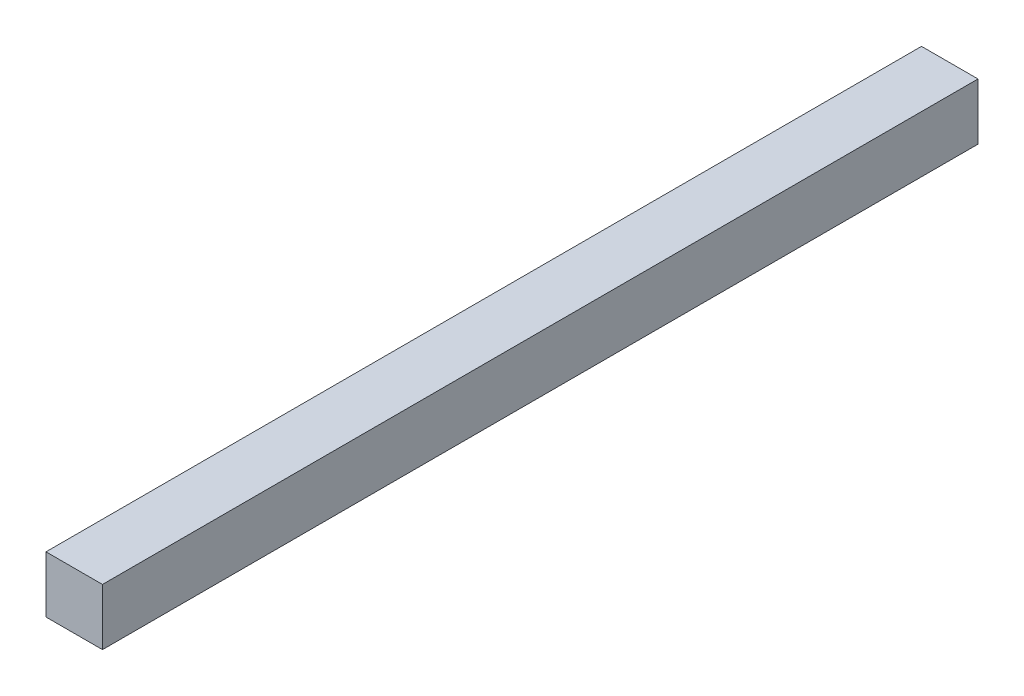
ISO-10303-21;
HEADER;
FILE_DESCRIPTION(('STEP AP214'),'2;1');
FILE_NAME('part.step','',(''),(''),'','','');
FILE_SCHEMA(('AUTOMOTIVE_DESIGN { 1 0 10303 214 1 1 1 1 }'));
ENDSEC;
DATA;
#1=APPLICATION_CONTEXT('core data for automotive mechanical design processes');
#2=APPLICATION_PROTOCOL_DEFINITION('international standard','automotive_design',2000,#1);
#3=PRODUCT_CONTEXT('',#1,'mechanical');
#4=PRODUCT('Part','Part','',(#3));
#5=PRODUCT_RELATED_PRODUCT_CATEGORY('part','',(#4));
#6=PRODUCT_DEFINITION_FORMATION('','',#4);
#7=PRODUCT_DEFINITION_CONTEXT('part definition',#1,'design');
#8=PRODUCT_DEFINITION('design','',#6,#7);
#9=PRODUCT_DEFINITION_SHAPE('','',#8);
#10=(LENGTH_UNIT() NAMED_UNIT(*) SI_UNIT(.MILLI.,.METRE.));
#11=(NAMED_UNIT(*) PLANE_ANGLE_UNIT() SI_UNIT($,.RADIAN.));
#12=(NAMED_UNIT(*) SI_UNIT($,.STERADIAN.) SOLID_ANGLE_UNIT());
#13=UNCERTAINTY_MEASURE_WITH_UNIT(LENGTH_MEASURE(1.E-05),#10,'distance_accuracy_value','');
#14=(GEOMETRIC_REPRESENTATION_CONTEXT(3) GLOBAL_UNCERTAINTY_ASSIGNED_CONTEXT((#13)) GLOBAL_UNIT_ASSIGNED_CONTEXT((#10,
#11,#12)) REPRESENTATION_CONTEXT('',''));
#15=CARTESIAN_POINT('',(0.,0.,0.));
#16=DIRECTION('',(0.,0.,1.));
#17=DIRECTION('',(1.,0.,0.));
#18=AXIS2_PLACEMENT_3D('',#15,#16,#17);
#19=CARTESIAN_POINT('',(0.,0.,620.));
#20=DIRECTION('',(1.,0.,0.));
#21=DIRECTION('',(0.,0.,-1.));
#22=AXIS2_PLACEMENT_3D('',#19,#20,#21);
#23=PLANE('',#22);
#24=DIRECTION('',(0.,-1.,0.));
#25=VECTOR('',#24,1.);
#26=CARTESIAN_POINT('',(0.,0.,0.));
#27=LINE('',#26,#25);
#28=CARTESIAN_POINT('',(0.,40.,0.));
#29=VERTEX_POINT('',#28);
#30=CARTESIAN_POINT('',(0.,0.,0.));
#31=VERTEX_POINT('',#30);
#32=EDGE_CURVE('E96',#29,#31,#27,.T.);
#33=ORIENTED_EDGE('',*,*,#32,.T.);
#34=DIRECTION('',(0.,0.,-1.));
#35=VECTOR('',#34,1.);
#36=CARTESIAN_POINT('',(0.,0.,620.));
#37=LINE('',#36,#35);
#38=CARTESIAN_POINT('',(0.,0.,620.));
#39=VERTEX_POINT('',#38);
#40=EDGE_CURVE('E11',#39,#31,#37,.T.);
#41=ORIENTED_EDGE('',*,*,#40,.F.);
#42=DIRECTION('',(0.,-1.,0.));
#43=VECTOR('',#42,1.);
#44=CARTESIAN_POINT('',(0.,0.,620.));
#45=LINE('',#44,#43);
#46=CARTESIAN_POINT('',(0.,40.,620.));
#47=VERTEX_POINT('',#46);
#48=EDGE_CURVE('E84',#47,#39,#45,.T.);
#49=ORIENTED_EDGE('',*,*,#48,.F.);
#50=DIRECTION('',(0.,0.,-1.));
#51=VECTOR('',#50,1.);
#52=CARTESIAN_POINT('',(0.,40.,620.));
#53=LINE('',#52,#51);
#54=EDGE_CURVE('E92',#47,#29,#53,.T.);
#55=ORIENTED_EDGE('',*,*,#54,.T.);
#56=EDGE_LOOP('',(#33,#41,#49,#55));
#57=FACE_BOUND('',#56,.T.);
#58=ADVANCED_FACE('F33',(#57),#23,.F.);
#59=CARTESIAN_POINT('',(0.,0.,620.));
#60=DIRECTION('',(0.,1.,0.));
#61=DIRECTION('',(0.,0.,1.));
#62=AXIS2_PLACEMENT_3D('',#59,#60,#61);
#63=PLANE('',#62);
#64=DIRECTION('',(1.,0.,0.));
#65=VECTOR('',#64,1.);
#66=CARTESIAN_POINT('',(0.,0.,0.));
#67=LINE('',#66,#65);
#68=CARTESIAN_POINT('',(40.,0.,0.));
#69=VERTEX_POINT('',#68);
#70=EDGE_CURVE('E88',#31,#69,#67,.T.);
#71=ORIENTED_EDGE('',*,*,#70,.T.);
#72=DIRECTION('',(0.,0.,-1.));
#73=VECTOR('',#72,1.);
#74=CARTESIAN_POINT('',(40.,0.,620.));
#75=LINE('',#74,#73);
#76=CARTESIAN_POINT('',(40.,0.,620.));
#77=VERTEX_POINT('',#76);
#78=EDGE_CURVE('E41',#77,#69,#75,.T.);
#79=ORIENTED_EDGE('',*,*,#78,.F.);
#80=DIRECTION('',(1.,0.,0.));
#81=VECTOR('',#80,1.);
#82=CARTESIAN_POINT('',(0.,0.,620.));
#83=LINE('',#82,#81);
#84=EDGE_CURVE('E79',#39,#77,#83,.T.);
#85=ORIENTED_EDGE('',*,*,#84,.F.);
#86=ORIENTED_EDGE('',*,*,#40,.T.);
#87=EDGE_LOOP('',(#71,#79,#85,#86));
#88=FACE_BOUND('',#87,.T.);
#89=ADVANCED_FACE('F87',(#88),#63,.F.);
#90=CARTESIAN_POINT('',(40.,0.,620.));
#91=DIRECTION('',(-1.,0.,0.));
#92=DIRECTION('',(0.,0.,1.));
#93=AXIS2_PLACEMENT_3D('',#90,#91,#92);
#94=PLANE('',#93);
#95=DIRECTION('',(0.,1.,0.));
#96=VECTOR('',#95,1.);
#97=CARTESIAN_POINT('',(40.,0.,0.));
#98=LINE('',#97,#96);
#99=CARTESIAN_POINT('',(40.,40.,0.));
#100=VERTEX_POINT('',#99);
#101=EDGE_CURVE('E66',#69,#100,#98,.T.);
#102=ORIENTED_EDGE('',*,*,#101,.T.);
#103=DIRECTION('',(0.,0.,-1.));
#104=VECTOR('',#103,1.);
#105=CARTESIAN_POINT('',(40.,40.,620.));
#106=LINE('',#105,#104);
#107=CARTESIAN_POINT('',(40.,40.,620.));
#108=VERTEX_POINT('',#107);
#109=EDGE_CURVE('E89',#108,#100,#106,.T.);
#110=ORIENTED_EDGE('',*,*,#109,.F.);
#111=DIRECTION('',(0.,1.,0.));
#112=VECTOR('',#111,1.);
#113=CARTESIAN_POINT('',(40.,0.,620.));
#114=LINE('',#113,#112);
#115=EDGE_CURVE('E82',#77,#108,#114,.T.);
#116=ORIENTED_EDGE('',*,*,#115,.F.);
#117=ORIENTED_EDGE('',*,*,#78,.T.);
#118=EDGE_LOOP('',(#102,#110,#116,#117));
#119=FACE_BOUND('',#118,.T.);
#120=ADVANCED_FACE('F90',(#119),#94,.F.);
#121=CARTESIAN_POINT('',(0.,40.,620.));
#122=DIRECTION('',(0.,-1.,0.));
#123=DIRECTION('',(0.,0.,-1.));
#124=AXIS2_PLACEMENT_3D('',#121,#122,#123);
#125=PLANE('',#124);
#126=DIRECTION('',(-1.,0.,0.));
#127=VECTOR('',#126,1.);
#128=CARTESIAN_POINT('',(0.,40.,0.));
#129=LINE('',#128,#127);
#130=EDGE_CURVE('E72',#100,#29,#129,.T.);
#131=ORIENTED_EDGE('',*,*,#130,.T.);
#132=ORIENTED_EDGE('',*,*,#54,.F.);
#133=DIRECTION('',(-1.,0.,0.));
#134=VECTOR('',#133,1.);
#135=CARTESIAN_POINT('',(0.,40.,620.));
#136=LINE('',#135,#134);
#137=EDGE_CURVE('E49',#108,#47,#136,.T.);
#138=ORIENTED_EDGE('',*,*,#137,.F.);
#139=ORIENTED_EDGE('',*,*,#109,.T.);
#140=EDGE_LOOP('',(#131,#132,#138,#139));
#141=FACE_BOUND('',#140,.T.);
#142=ADVANCED_FACE('F103',(#141),#125,.F.);
#143=CARTESIAN_POINT('',(0.,0.,620.));
#144=DIRECTION('',(0.,0.,-1.));
#145=DIRECTION('',(-1.,0.,0.));
#146=AXIS2_PLACEMENT_3D('',#143,#144,#145);
#147=PLANE('',#146);
#148=ORIENTED_EDGE('',*,*,#48,.T.);
#149=ORIENTED_EDGE('',*,*,#84,.T.);
#150=ORIENTED_EDGE('',*,*,#115,.T.);
#151=ORIENTED_EDGE('',*,*,#137,.T.);
#152=EDGE_LOOP('',(#148,#149,#150,#151));
#153=FACE_BOUND('',#152,.T.);
#154=ADVANCED_FACE('F80',(#153),#147,.F.);
#155=CARTESIAN_POINT('',(0.,0.,0.));
#156=DIRECTION('',(0.,0.,-1.));
#157=DIRECTION('',(-1.,0.,0.));
#158=AXIS2_PLACEMENT_3D('',#155,#156,#157);
#159=PLANE('',#158);
#160=ORIENTED_EDGE('',*,*,#32,.F.);
#161=ORIENTED_EDGE('',*,*,#130,.F.);
#162=ORIENTED_EDGE('',*,*,#101,.F.);
#163=ORIENTED_EDGE('',*,*,#70,.F.);
#164=EDGE_LOOP('',(#160,#161,#162,#163));
#165=FACE_BOUND('',#164,.T.);
#166=ADVANCED_FACE('F106',(#165),#159,.T.);
#167=CLOSED_SHELL('',(#58,#89,#120,#142,#154,#166));
#168=MANIFOLD_SOLID_BREP('B2',#167);
#169=ADVANCED_BREP_SHAPE_REPRESENTATION('',(#18,#168),#14);
#170=SHAPE_DEFINITION_REPRESENTATION(#9,#169);
ENDSEC;
END-ISO-10303-21;
